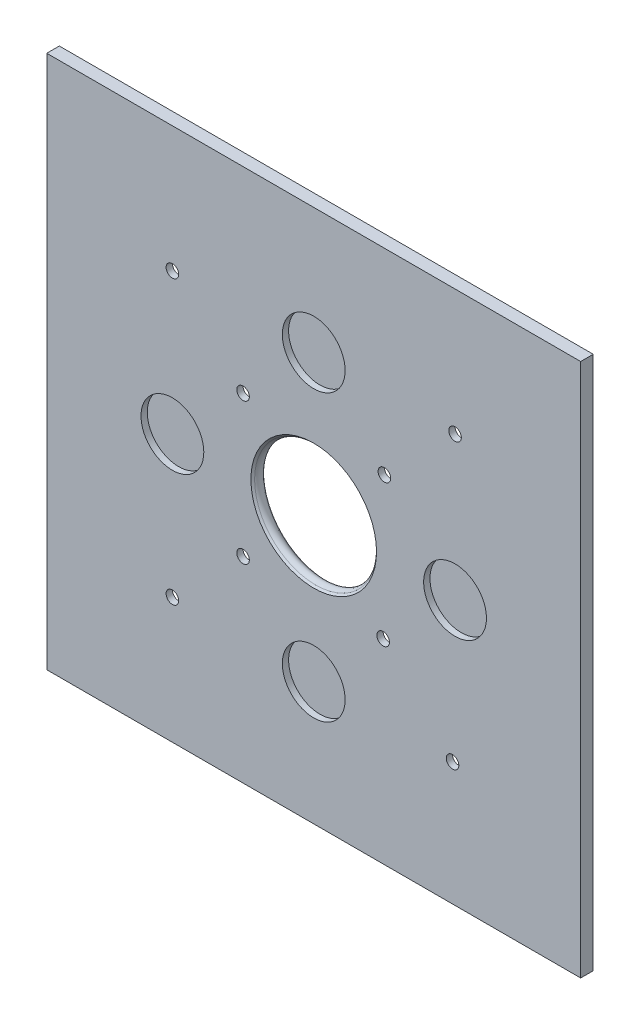
ISO-10303-21;
HEADER;
FILE_DESCRIPTION(('STEP AP214'),'2;1');
FILE_NAME('part.step','',(''),(''),'','','');
FILE_SCHEMA(('AUTOMOTIVE_DESIGN { 1 0 10303 214 1 1 1 1 }'));
ENDSEC;
DATA;
#1=APPLICATION_CONTEXT('core data for automotive mechanical design processes');
#2=APPLICATION_PROTOCOL_DEFINITION('international standard','automotive_design',2000,#1);
#3=PRODUCT_CONTEXT('',#1,'mechanical');
#4=PRODUCT('Part','Part','',(#3));
#5=PRODUCT_RELATED_PRODUCT_CATEGORY('part','',(#4));
#6=PRODUCT_DEFINITION_FORMATION('','',#4);
#7=PRODUCT_DEFINITION_CONTEXT('part definition',#1,'design');
#8=PRODUCT_DEFINITION('design','',#6,#7);
#9=PRODUCT_DEFINITION_SHAPE('','',#8);
#10=(LENGTH_UNIT() NAMED_UNIT(*) SI_UNIT(.MILLI.,.METRE.));
#11=(NAMED_UNIT(*) PLANE_ANGLE_UNIT() SI_UNIT($,.RADIAN.));
#12=(NAMED_UNIT(*) SI_UNIT($,.STERADIAN.) SOLID_ANGLE_UNIT());
#13=UNCERTAINTY_MEASURE_WITH_UNIT(LENGTH_MEASURE(1.E-05),#10,'distance_accuracy_value','');
#14=(GEOMETRIC_REPRESENTATION_CONTEXT(3) GLOBAL_UNCERTAINTY_ASSIGNED_CONTEXT((#13)) GLOBAL_UNIT_ASSIGNED_CONTEXT((#10,
#11,#12)) REPRESENTATION_CONTEXT('',''));
#15=CARTESIAN_POINT('',(0.,0.,0.));
#16=DIRECTION('',(0.,0.,1.));
#17=DIRECTION('',(1.,0.,0.));
#18=AXIS2_PLACEMENT_3D('',#15,#16,#17);
#19=CARTESIAN_POINT('',(-15.3853971962617,22.3971028037383,2.));
#20=DIRECTION('',(1.,0.,0.));
#21=DIRECTION('',(0.,1.,0.));
#22=AXIS2_PLACEMENT_3D('',#19,#20,#21);
#23=PLANE('',#22);
#24=DIRECTION('',(0.,-1.,0.));
#25=VECTOR('',#24,1.);
#26=CARTESIAN_POINT('',(-15.3853971962617,22.3971028037383,0.));
#27=LINE('',#26,#25);
#28=CARTESIAN_POINT('',(-15.3853971962617,22.3971028037383,0.));
#29=VERTEX_POINT('',#28);
#30=CARTESIAN_POINT('',(-15.3853971962617,-62.6028971962617,0.));
#31=VERTEX_POINT('',#30);
#32=EDGE_CURVE('E101',#29,#31,#27,.T.);
#33=ORIENTED_EDGE('',*,*,#32,.T.);
#34=DIRECTION('',(0.,0.,-1.));
#35=VECTOR('',#34,1.);
#36=CARTESIAN_POINT('',(-15.3853971962617,-62.6028971962617,2.));
#37=LINE('',#36,#35);
#38=CARTESIAN_POINT('',(-15.3853971962617,-62.6028971962617,2.));
#39=VERTEX_POINT('',#38);
#40=EDGE_CURVE('E93',#39,#31,#37,.T.);
#41=ORIENTED_EDGE('',*,*,#40,.F.);
#42=DIRECTION('',(0.,-1.,0.));
#43=VECTOR('',#42,1.);
#44=CARTESIAN_POINT('',(-15.3853971962617,22.3971028037383,2.));
#45=LINE('',#44,#43);
#46=CARTESIAN_POINT('',(-15.3853971962617,22.3971028037383,2.));
#47=VERTEX_POINT('',#46);
#48=EDGE_CURVE('E84',#47,#39,#45,.T.);
#49=ORIENTED_EDGE('',*,*,#48,.F.);
#50=DIRECTION('',(0.,0.,-1.));
#51=VECTOR('',#50,1.);
#52=CARTESIAN_POINT('',(-15.3853971962617,22.3971028037383,2.));
#53=LINE('',#52,#51);
#54=EDGE_CURVE('E50',#47,#29,#53,.T.);
#55=ORIENTED_EDGE('',*,*,#54,.T.);
#56=EDGE_LOOP('',(#33,#41,#49,#55));
#57=FACE_BOUND('',#56,.T.);
#58=ADVANCED_FACE('F33',(#57),#23,.F.);
#59=CARTESIAN_POINT('',(-15.3853971962617,-62.6028971962617,2.));
#60=DIRECTION('',(0.,1.,0.));
#61=DIRECTION('',(0.,0.,1.));
#62=AXIS2_PLACEMENT_3D('',#59,#60,#61);
#63=PLANE('',#62);
#64=DIRECTION('',(1.,0.,0.));
#65=VECTOR('',#64,1.);
#66=CARTESIAN_POINT('',(-15.3853971962617,-62.6028971962617,0.));
#67=LINE('',#66,#65);
#68=CARTESIAN_POINT('',(69.6146028037383,-62.6028971962617,0.));
#69=VERTEX_POINT('',#68);
#70=EDGE_CURVE('E90',#31,#69,#67,.T.);
#71=ORIENTED_EDGE('',*,*,#70,.T.);
#72=DIRECTION('',(0.,0.,-1.));
#73=VECTOR('',#72,1.);
#74=CARTESIAN_POINT('',(69.6146028037383,-62.6028971962617,2.));
#75=LINE('',#74,#73);
#76=CARTESIAN_POINT('',(69.6146028037383,-62.6028971962617,2.));
#77=VERTEX_POINT('',#76);
#78=EDGE_CURVE('E88',#77,#69,#75,.T.);
#79=ORIENTED_EDGE('',*,*,#78,.F.);
#80=DIRECTION('',(1.,0.,0.));
#81=VECTOR('',#80,1.);
#82=CARTESIAN_POINT('',(-15.3853971962617,-62.6028971962617,2.));
#83=LINE('',#82,#81);
#84=EDGE_CURVE('E76',#39,#77,#83,.T.);
#85=ORIENTED_EDGE('',*,*,#84,.F.);
#86=ORIENTED_EDGE('',*,*,#40,.T.);
#87=EDGE_LOOP('',(#71,#79,#85,#86));
#88=FACE_BOUND('',#87,.T.);
#89=ADVANCED_FACE('F89',(#88),#63,.F.);
#90=CARTESIAN_POINT('',(69.6146028037383,22.3971028037383,2.));
#91=DIRECTION('',(1.,0.,0.));
#92=DIRECTION('',(0.,1.,0.));
#93=AXIS2_PLACEMENT_3D('',#90,#91,#92);
#94=PLANE('',#93);
#95=DIRECTION('',(0.,-1.,0.));
#96=VECTOR('',#95,1.);
#97=CARTESIAN_POINT('',(69.6146028037383,22.3971028037383,0.));
#98=LINE('',#97,#96);
#99=CARTESIAN_POINT('',(69.6146028037383,22.3971028037383,0.));
#100=VERTEX_POINT('',#99);
#101=EDGE_CURVE('E105',#100,#69,#98,.T.);
#102=ORIENTED_EDGE('',*,*,#101,.F.);
#103=DIRECTION('',(0.,0.,-1.));
#104=VECTOR('',#103,1.);
#105=CARTESIAN_POINT('',(69.6146028037383,22.3971028037383,2.));
#106=LINE('',#105,#104);
#107=CARTESIAN_POINT('',(69.6146028037383,22.3971028037383,2.));
#108=VERTEX_POINT('',#107);
#109=EDGE_CURVE('E64',#108,#100,#106,.T.);
#110=ORIENTED_EDGE('',*,*,#109,.F.);
#111=DIRECTION('',(0.,-1.,0.));
#112=VECTOR('',#111,1.);
#113=CARTESIAN_POINT('',(69.6146028037383,22.3971028037383,2.));
#114=LINE('',#113,#112);
#115=EDGE_CURVE('E83',#108,#77,#114,.T.);
#116=ORIENTED_EDGE('',*,*,#115,.T.);
#117=ORIENTED_EDGE('',*,*,#78,.T.);
#118=EDGE_LOOP('',(#102,#110,#116,#117));
#119=FACE_BOUND('',#118,.T.);
#120=ADVANCED_FACE('F95',(#119),#94,.T.);
#121=CARTESIAN_POINT('',(-15.3853971962617,22.3971028037383,2.));
#122=DIRECTION('',(0.,1.,0.));
#123=DIRECTION('',(0.,0.,1.));
#124=AXIS2_PLACEMENT_3D('',#121,#122,#123);
#125=PLANE('',#124);
#126=DIRECTION('',(1.,0.,0.));
#127=VECTOR('',#126,1.);
#128=CARTESIAN_POINT('',(-15.3853971962617,22.3971028037383,0.));
#129=LINE('',#128,#127);
#130=EDGE_CURVE('E107',#29,#100,#129,.T.);
#131=ORIENTED_EDGE('',*,*,#130,.F.);
#132=ORIENTED_EDGE('',*,*,#54,.F.);
#133=DIRECTION('',(1.,0.,0.));
#134=VECTOR('',#133,1.);
#135=CARTESIAN_POINT('',(-15.3853971962617,22.3971028037383,2.));
#136=LINE('',#135,#134);
#137=EDGE_CURVE('E96',#47,#108,#136,.T.);
#138=ORIENTED_EDGE('',*,*,#137,.T.);
#139=ORIENTED_EDGE('',*,*,#109,.T.);
#140=EDGE_LOOP('',(#131,#132,#138,#139));
#141=FACE_BOUND('',#140,.T.);
#142=ADVANCED_FACE('F213',(#141),#125,.T.);
#143=CARTESIAN_POINT('',(0.,0.,2.));
#144=DIRECTION('',(0.,0.,1.));
#145=DIRECTION('',(1.,0.,0.));
#146=AXIS2_PLACEMENT_3D('',#143,#144,#145);
#147=PLANE('',#146);
#148=CARTESIAN_POINT('',(27.1146028037383,-20.1028971962617,2.));
#149=DIRECTION('',(0.,0.,1.));
#150=DIRECTION('',(1.,0.,0.));
#151=AXIS2_PLACEMENT_3D('',#148,#149,#150);
#152=CIRCLE('',#151,10.);
#153=CARTESIAN_POINT('',(37.1146028037384,-20.1028971962617,2.));
#154=VERTEX_POINT('',#153);
#155=EDGE_CURVE('E142',#154,#154,#152,.F.);
#156=ORIENTED_EDGE('',*,*,#155,.T.);
#157=EDGE_LOOP('',(#156));
#158=FACE_BOUND('',#157,.T.);
#159=CARTESIAN_POINT('',(38.3646028037383,-8.8528971962617,2.));
#160=DIRECTION('',(0.,0.,-1.));
#161=DIRECTION('',(-1.,0.,0.));
#162=AXIS2_PLACEMENT_3D('',#159,#160,#161);
#163=CIRCLE('',#162,0.999999999999998);
#164=CARTESIAN_POINT('',(37.3646028037383,-8.8528971962617,2.));
#165=VERTEX_POINT('',#164);
#166=EDGE_CURVE('E353',#165,#165,#163,.T.);
#167=ORIENTED_EDGE('',*,*,#166,.T.);
#168=EDGE_LOOP('',(#167));
#169=FACE_BOUND('',#168,.T.);
#170=CARTESIAN_POINT('',(4.61460280373833,2.39710280373829,2.));
#171=DIRECTION('',(0.,0.,-1.));
#172=DIRECTION('',(-1.,0.,0.));
#173=AXIS2_PLACEMENT_3D('',#170,#171,#172);
#174=CIRCLE('',#173,1.);
#175=CARTESIAN_POINT('',(3.61460280373833,2.39710280373829,2.));
#176=VERTEX_POINT('',#175);
#177=EDGE_CURVE('E357',#176,#176,#174,.T.);
#178=ORIENTED_EDGE('',*,*,#177,.T.);
#179=EDGE_LOOP('',(#178));
#180=FACE_BOUND('',#179,.T.);
#181=CARTESIAN_POINT('',(15.8646028037383,-8.8528971962617,2.));
#182=DIRECTION('',(0.,0.,-1.));
#183=DIRECTION('',(-1.,0.,0.));
#184=AXIS2_PLACEMENT_3D('',#181,#182,#183);
#185=CIRCLE('',#184,1.);
#186=CARTESIAN_POINT('',(14.8646028037383,-8.8528971962617,2.));
#187=VERTEX_POINT('',#186);
#188=EDGE_CURVE('E366',#187,#187,#185,.T.);
#189=ORIENTED_EDGE('',*,*,#188,.T.);
#190=EDGE_LOOP('',(#189));
#191=FACE_BOUND('',#190,.T.);
#192=CARTESIAN_POINT('',(15.8646028037383,-31.3528971962617,2.));
#193=DIRECTION('',(0.,0.,-1.));
#194=DIRECTION('',(-1.,0.,0.));
#195=AXIS2_PLACEMENT_3D('',#192,#193,#194);
#196=CIRCLE('',#195,1.);
#197=CARTESIAN_POINT('',(14.8646028037383,-31.3528971962617,2.));
#198=VERTEX_POINT('',#197);
#199=EDGE_CURVE('E368',#198,#198,#196,.T.);
#200=ORIENTED_EDGE('',*,*,#199,.T.);
#201=EDGE_LOOP('',(#200));
#202=FACE_BOUND('',#201,.T.);
#203=CARTESIAN_POINT('',(49.6146028037383,2.39710280373829,2.));
#204=DIRECTION('',(0.,0.,-1.));
#205=DIRECTION('',(-1.,0.,0.));
#206=AXIS2_PLACEMENT_3D('',#203,#204,#205);
#207=CIRCLE('',#206,0.999999999999998);
#208=CARTESIAN_POINT('',(48.6146028037383,2.39710280373829,2.));
#209=VERTEX_POINT('',#208);
#210=EDGE_CURVE('E351',#209,#209,#207,.T.);
#211=ORIENTED_EDGE('',*,*,#210,.T.);
#212=EDGE_LOOP('',(#211));
#213=FACE_BOUND('',#212,.T.);
#214=CARTESIAN_POINT('',(49.2154935543501,-42.9950493019402,2.));
#215=DIRECTION('',(0.,0.,-1.));
#216=DIRECTION('',(-1.,0.,0.));
#217=AXIS2_PLACEMENT_3D('',#214,#215,#216);
#218=CIRCLE('',#217,0.999999999999998);
#219=CARTESIAN_POINT('',(48.2154935543501,-42.9950493019402,2.));
#220=VERTEX_POINT('',#219);
#221=EDGE_CURVE('E354',#220,#220,#218,.T.);
#222=ORIENTED_EDGE('',*,*,#221,.T.);
#223=EDGE_LOOP('',(#222));
#224=FACE_BOUND('',#223,.T.);
#225=CARTESIAN_POINT('',(38.1650481790442,-31.5489732491009,2.));
#226=DIRECTION('',(0.,0.,-1.));
#227=DIRECTION('',(-1.,0.,0.));
#228=AXIS2_PLACEMENT_3D('',#225,#226,#227);
#229=CIRCLE('',#228,0.999999999999998);
#230=CARTESIAN_POINT('',(37.1650481790442,-31.5489732491009,2.));
#231=VERTEX_POINT('',#230);
#232=EDGE_CURVE('E360',#231,#231,#229,.T.);
#233=ORIENTED_EDGE('',*,*,#232,.T.);
#234=EDGE_LOOP('',(#233));
#235=FACE_BOUND('',#234,.T.);
#236=CARTESIAN_POINT('',(4.61460280373834,-42.6028971962617,2.));
#237=DIRECTION('',(0.,0.,-1.));
#238=DIRECTION('',(-1.,0.,0.));
#239=AXIS2_PLACEMENT_3D('',#236,#237,#238);
#240=CIRCLE('',#239,1.);
#241=CARTESIAN_POINT('',(3.61460280373833,-42.6028971962617,2.));
#242=VERTEX_POINT('',#241);
#243=EDGE_CURVE('E118',#242,#242,#240,.T.);
#244=ORIENTED_EDGE('',*,*,#243,.T.);
#245=EDGE_LOOP('',(#244));
#246=FACE_BOUND('',#245,.T.);
#247=CARTESIAN_POINT('',(49.6146028037383,-20.4950493019402,2.));
#248=DIRECTION('',(0.,0.,1.));
#249=DIRECTION('',(1.,0.,0.));
#250=AXIS2_PLACEMENT_3D('',#247,#248,#249);
#251=CIRCLE('',#250,5.);
#252=CARTESIAN_POINT('',(54.6146028037383,-20.4950493019402,2.));
#253=VERTEX_POINT('',#252);
#254=EDGE_CURVE('E410',#253,#253,#251,.T.);
#255=ORIENTED_EDGE('',*,*,#254,.F.);
#256=EDGE_LOOP('',(#255));
#257=FACE_BOUND('',#256,.T.);
#258=CARTESIAN_POINT('',(27.1146028037383,2.39710280373829,2.));
#259=DIRECTION('',(0.,0.,1.));
#260=DIRECTION('',(1.,0.,0.));
#261=AXIS2_PLACEMENT_3D('',#258,#259,#260);
#262=CIRCLE('',#261,5.);
#263=CARTESIAN_POINT('',(32.1146028037383,2.39710280373829,2.));
#264=VERTEX_POINT('',#263);
#265=EDGE_CURVE('E416',#264,#264,#262,.T.);
#266=ORIENTED_EDGE('',*,*,#265,.F.);
#267=EDGE_LOOP('',(#266));
#268=FACE_BOUND('',#267,.T.);
#269=CARTESIAN_POINT('',(27.1146028037383,-42.9950493019402,2.));
#270=DIRECTION('',(0.,0.,1.));
#271=DIRECTION('',(1.,0.,0.));
#272=AXIS2_PLACEMENT_3D('',#269,#270,#271);
#273=CIRCLE('',#272,5.);
#274=CARTESIAN_POINT('',(32.1146028037383,-42.9950493019402,2.));
#275=VERTEX_POINT('',#274);
#276=EDGE_CURVE('E422',#275,#275,#273,.T.);
#277=ORIENTED_EDGE('',*,*,#276,.F.);
#278=EDGE_LOOP('',(#277));
#279=FACE_BOUND('',#278,.T.);
#280=CARTESIAN_POINT('',(4.61460280373833,-20.1028971962617,2.));
#281=DIRECTION('',(0.,0.,1.));
#282=DIRECTION('',(1.,0.,0.));
#283=AXIS2_PLACEMENT_3D('',#280,#281,#282);
#284=CIRCLE('',#283,5.);
#285=CARTESIAN_POINT('',(9.61460280373833,-20.1028971962617,2.));
#286=VERTEX_POINT('',#285);
#287=EDGE_CURVE('E406',#286,#286,#284,.T.);
#288=ORIENTED_EDGE('',*,*,#287,.F.);
#289=EDGE_LOOP('',(#288));
#290=FACE_BOUND('',#289,.T.);
#291=ORIENTED_EDGE('',*,*,#48,.T.);
#292=ORIENTED_EDGE('',*,*,#84,.T.);
#293=ORIENTED_EDGE('',*,*,#115,.F.);
#294=ORIENTED_EDGE('',*,*,#137,.F.);
#295=EDGE_LOOP('',(#291,#292,#293,#294));
#296=FACE_BOUND('',#295,.T.);
#297=ADVANCED_FACE('F80',(#158,#169,#180,#191,#202,#213,#224,#235,#246,#257,#268,#279,#290,
#296),#147,.T.);
#298=CARTESIAN_POINT('',(0.,0.,0.));
#299=DIRECTION('',(0.,0.,1.));
#300=DIRECTION('',(1.,0.,0.));
#301=AXIS2_PLACEMENT_3D('',#298,#299,#300);
#302=PLANE('',#301);
#303=CARTESIAN_POINT('',(27.1146028037383,-20.1028971962617,0.));
#304=DIRECTION('',(0.,0.,1.));
#305=DIRECTION('',(1.,0.,0.));
#306=AXIS2_PLACEMENT_3D('',#303,#304,#305);
#307=CIRCLE('',#306,10.);
#308=CARTESIAN_POINT('',(37.1146028037383,-20.1028971962617,0.));
#309=VERTEX_POINT('',#308);
#310=EDGE_CURVE('E113',#309,#309,#307,.T.);
#311=ORIENTED_EDGE('',*,*,#310,.T.);
#312=EDGE_LOOP('',(#311));
#313=FACE_BOUND('',#312,.T.);
#314=CARTESIAN_POINT('',(4.61460280373834,-42.6028971962617,0.));
#315=DIRECTION('',(0.,0.,-1.));
#316=DIRECTION('',(-1.,0.,0.));
#317=AXIS2_PLACEMENT_3D('',#314,#315,#316);
#318=CIRCLE('',#317,5.);
#319=CARTESIAN_POINT('',(-0.385397196261665,-42.6028971962617,0.));
#320=VERTEX_POINT('',#319);
#321=EDGE_CURVE('E185',#320,#320,#318,.T.);
#322=ORIENTED_EDGE('',*,*,#321,.F.);
#323=EDGE_LOOP('',(#322));
#324=FACE_BOUND('',#323,.T.);
#325=CARTESIAN_POINT('',(38.3646028037383,-8.8528971962617,0.));
#326=DIRECTION('',(0.,0.,-1.));
#327=DIRECTION('',(-1.,0.,0.));
#328=AXIS2_PLACEMENT_3D('',#325,#326,#327);
#329=CIRCLE('',#328,5.);
#330=CARTESIAN_POINT('',(33.3646028037383,-8.8528971962617,0.));
#331=VERTEX_POINT('',#330);
#332=EDGE_CURVE('E189',#331,#331,#329,.T.);
#333=ORIENTED_EDGE('',*,*,#332,.F.);
#334=EDGE_LOOP('',(#333));
#335=FACE_BOUND('',#334,.T.);
#336=CARTESIAN_POINT('',(49.6146028037383,2.39710280373829,0.));
#337=DIRECTION('',(0.,0.,-1.));
#338=DIRECTION('',(-1.,0.,0.));
#339=AXIS2_PLACEMENT_3D('',#336,#337,#338);
#340=CIRCLE('',#339,5.);
#341=CARTESIAN_POINT('',(44.6146028037383,2.39710280373829,0.));
#342=VERTEX_POINT('',#341);
#343=EDGE_CURVE('E193',#342,#342,#340,.T.);
#344=ORIENTED_EDGE('',*,*,#343,.F.);
#345=EDGE_LOOP('',(#344));
#346=FACE_BOUND('',#345,.T.);
#347=CARTESIAN_POINT('',(38.1650481790442,-31.5489732491009,0.));
#348=DIRECTION('',(0.,0.,-1.));
#349=DIRECTION('',(-1.,0.,0.));
#350=AXIS2_PLACEMENT_3D('',#347,#348,#349);
#351=CIRCLE('',#350,5.);
#352=CARTESIAN_POINT('',(33.1650481790442,-31.5489732491009,0.));
#353=VERTEX_POINT('',#352);
#354=EDGE_CURVE('E197',#353,#353,#351,.T.);
#355=ORIENTED_EDGE('',*,*,#354,.F.);
#356=EDGE_LOOP('',(#355));
#357=FACE_BOUND('',#356,.T.);
#358=CARTESIAN_POINT('',(15.8646028037383,-8.8528971962617,0.));
#359=DIRECTION('',(0.,0.,-1.));
#360=DIRECTION('',(-1.,0.,0.));
#361=AXIS2_PLACEMENT_3D('',#358,#359,#360);
#362=CIRCLE('',#361,5.);
#363=CARTESIAN_POINT('',(10.8646028037383,-8.8528971962617,0.));
#364=VERTEX_POINT('',#363);
#365=EDGE_CURVE('E139',#364,#364,#362,.T.);
#366=ORIENTED_EDGE('',*,*,#365,.F.);
#367=EDGE_LOOP('',(#366));
#368=FACE_BOUND('',#367,.T.);
#369=CARTESIAN_POINT('',(4.61460280373833,2.39710280373829,0.));
#370=DIRECTION('',(0.,0.,-1.));
#371=DIRECTION('',(-1.,0.,0.));
#372=AXIS2_PLACEMENT_3D('',#369,#370,#371);
#373=CIRCLE('',#372,5.);
#374=CARTESIAN_POINT('',(-0.385397196261668,2.39710280373829,0.));
#375=VERTEX_POINT('',#374);
#376=EDGE_CURVE('E204',#375,#375,#373,.T.);
#377=ORIENTED_EDGE('',*,*,#376,.F.);
#378=EDGE_LOOP('',(#377));
#379=FACE_BOUND('',#378,.T.);
#380=CARTESIAN_POINT('',(15.8646028037383,-31.3528971962617,0.));
#381=DIRECTION('',(0.,0.,-1.));
#382=DIRECTION('',(-1.,0.,0.));
#383=AXIS2_PLACEMENT_3D('',#380,#381,#382);
#384=CIRCLE('',#383,5.);
#385=CARTESIAN_POINT('',(10.8646028037383,-31.3528971962617,0.));
#386=VERTEX_POINT('',#385);
#387=EDGE_CURVE('E208',#386,#386,#384,.T.);
#388=ORIENTED_EDGE('',*,*,#387,.F.);
#389=EDGE_LOOP('',(#388));
#390=FACE_BOUND('',#389,.T.);
#391=CARTESIAN_POINT('',(49.2154935543501,-42.9950493019402,0.));
#392=DIRECTION('',(0.,0.,-1.));
#393=DIRECTION('',(-1.,0.,0.));
#394=AXIS2_PLACEMENT_3D('',#391,#392,#393);
#395=CIRCLE('',#394,5.);
#396=CARTESIAN_POINT('',(44.2154935543502,-42.9950493019402,0.));
#397=VERTEX_POINT('',#396);
#398=EDGE_CURVE('E212',#397,#397,#395,.T.);
#399=ORIENTED_EDGE('',*,*,#398,.F.);
#400=EDGE_LOOP('',(#399));
#401=FACE_BOUND('',#400,.T.);
#402=ORIENTED_EDGE('',*,*,#32,.F.);
#403=ORIENTED_EDGE('',*,*,#130,.T.);
#404=ORIENTED_EDGE('',*,*,#101,.T.);
#405=ORIENTED_EDGE('',*,*,#70,.F.);
#406=EDGE_LOOP('',(#402,#403,#404,#405));
#407=FACE_BOUND('',#406,.T.);
#408=ADVANCED_FACE('F177',(#313,#324,#335,#346,#357,#368,#379,#390,#401,#407),#302,.F.);
#409=CARTESIAN_POINT('',(4.61460280373833,-20.1028971962617,1.));
#410=DIRECTION('',(0.,0.,1.));
#411=DIRECTION('',(1.,0.,0.));
#412=AXIS2_PLACEMENT_3D('',#409,#410,#411);
#413=CYLINDRICAL_SURFACE('',#412,5.);
#414=CARTESIAN_POINT('',(4.61460280373833,-20.1028971962617,1.));
#415=DIRECTION('',(0.,0.,1.));
#416=DIRECTION('',(1.,0.,0.));
#417=AXIS2_PLACEMENT_3D('',#414,#415,#416);
#418=CIRCLE('',#417,5.);
#419=CARTESIAN_POINT('',(9.61460280373833,-20.1028971962617,1.));
#420=VERTEX_POINT('',#419);
#421=EDGE_CURVE('E425',#420,#420,#418,.T.);
#422=ORIENTED_EDGE('',*,*,#421,.F.);
#423=EDGE_LOOP('',(#422));
#424=FACE_BOUND('',#423,.T.);
#425=ORIENTED_EDGE('',*,*,#287,.T.);
#426=EDGE_LOOP('',(#425));
#427=FACE_BOUND('',#426,.T.);
#428=ADVANCED_FACE('F180',(#424,#427),#413,.F.);
#429=CARTESIAN_POINT('',(4.61460280373833,-20.1028971962617,1.));
#430=DIRECTION('',(0.,0.,1.));
#431=DIRECTION('',(1.,0.,0.));
#432=AXIS2_PLACEMENT_3D('',#429,#430,#431);
#433=PLANE('',#432);
#434=ORIENTED_EDGE('',*,*,#421,.T.);
#435=EDGE_LOOP('',(#434));
#436=FACE_BOUND('',#435,.T.);
#437=ADVANCED_FACE('F226',(#436),#433,.T.);
#438=CARTESIAN_POINT('',(27.1146028037383,-42.9950493019402,1.));
#439=DIRECTION('',(0.,0.,1.));
#440=DIRECTION('',(1.,0.,0.));
#441=AXIS2_PLACEMENT_3D('',#438,#439,#440);
#442=CYLINDRICAL_SURFACE('',#441,5.);
#443=CARTESIAN_POINT('',(27.1146028037383,-42.9950493019402,1.));
#444=DIRECTION('',(0.,0.,1.));
#445=DIRECTION('',(1.,0.,0.));
#446=AXIS2_PLACEMENT_3D('',#443,#444,#445);
#447=CIRCLE('',#446,5.);
#448=CARTESIAN_POINT('',(32.1146028037383,-42.9950493019402,1.));
#449=VERTEX_POINT('',#448);
#450=EDGE_CURVE('E419',#449,#449,#447,.T.);
#451=ORIENTED_EDGE('',*,*,#450,.F.);
#452=EDGE_LOOP('',(#451));
#453=FACE_BOUND('',#452,.T.);
#454=ORIENTED_EDGE('',*,*,#276,.T.);
#455=EDGE_LOOP('',(#454));
#456=FACE_BOUND('',#455,.T.);
#457=ADVANCED_FACE('F230',(#453,#456),#442,.F.);
#458=CARTESIAN_POINT('',(27.1146028037383,-42.9950493019402,1.));
#459=DIRECTION('',(0.,0.,1.));
#460=DIRECTION('',(1.,0.,0.));
#461=AXIS2_PLACEMENT_3D('',#458,#459,#460);
#462=PLANE('',#461);
#463=ORIENTED_EDGE('',*,*,#450,.T.);
#464=EDGE_LOOP('',(#463));
#465=FACE_BOUND('',#464,.T.);
#466=ADVANCED_FACE('F234',(#465),#462,.T.);
#467=CARTESIAN_POINT('',(27.1146028037383,2.39710280373829,1.));
#468=DIRECTION('',(0.,0.,1.));
#469=DIRECTION('',(1.,0.,0.));
#470=AXIS2_PLACEMENT_3D('',#467,#468,#469);
#471=CYLINDRICAL_SURFACE('',#470,5.);
#472=CARTESIAN_POINT('',(27.1146028037383,2.39710280373829,1.));
#473=DIRECTION('',(0.,0.,1.));
#474=DIRECTION('',(1.,0.,0.));
#475=AXIS2_PLACEMENT_3D('',#472,#473,#474);
#476=CIRCLE('',#475,5.);
#477=CARTESIAN_POINT('',(32.1146028037383,2.39710280373829,1.));
#478=VERTEX_POINT('',#477);
#479=EDGE_CURVE('E413',#478,#478,#476,.T.);
#480=ORIENTED_EDGE('',*,*,#479,.F.);
#481=EDGE_LOOP('',(#480));
#482=FACE_BOUND('',#481,.T.);
#483=ORIENTED_EDGE('',*,*,#265,.T.);
#484=EDGE_LOOP('',(#483));
#485=FACE_BOUND('',#484,.T.);
#486=ADVANCED_FACE('F238',(#482,#485),#471,.F.);
#487=CARTESIAN_POINT('',(27.1146028037383,2.39710280373829,1.));
#488=DIRECTION('',(0.,0.,1.));
#489=DIRECTION('',(1.,0.,0.));
#490=AXIS2_PLACEMENT_3D('',#487,#488,#489);
#491=PLANE('',#490);
#492=ORIENTED_EDGE('',*,*,#479,.T.);
#493=EDGE_LOOP('',(#492));
#494=FACE_BOUND('',#493,.T.);
#495=ADVANCED_FACE('F242',(#494),#491,.T.);
#496=CARTESIAN_POINT('',(49.6146028037383,-20.4950493019402,1.));
#497=DIRECTION('',(0.,0.,1.));
#498=DIRECTION('',(1.,0.,0.));
#499=AXIS2_PLACEMENT_3D('',#496,#497,#498);
#500=CYLINDRICAL_SURFACE('',#499,5.);
#501=CARTESIAN_POINT('',(49.6146028037383,-20.4950493019402,1.));
#502=DIRECTION('',(0.,0.,1.));
#503=DIRECTION('',(1.,0.,0.));
#504=AXIS2_PLACEMENT_3D('',#501,#502,#503);
#505=CIRCLE('',#504,5.);
#506=CARTESIAN_POINT('',(54.6146028037383,-20.4950493019402,1.));
#507=VERTEX_POINT('',#506);
#508=EDGE_CURVE('E103',#507,#507,#505,.T.);
#509=ORIENTED_EDGE('',*,*,#508,.F.);
#510=EDGE_LOOP('',(#509));
#511=FACE_BOUND('',#510,.T.);
#512=ORIENTED_EDGE('',*,*,#254,.T.);
#513=EDGE_LOOP('',(#512));
#514=FACE_BOUND('',#513,.T.);
#515=ADVANCED_FACE('F246',(#511,#514),#500,.F.);
#516=CARTESIAN_POINT('',(49.6146028037383,-20.4950493019402,1.));
#517=DIRECTION('',(0.,0.,1.));
#518=DIRECTION('',(1.,0.,0.));
#519=AXIS2_PLACEMENT_3D('',#516,#517,#518);
#520=PLANE('',#519);
#521=ORIENTED_EDGE('',*,*,#508,.T.);
#522=EDGE_LOOP('',(#521));
#523=FACE_BOUND('',#522,.T.);
#524=ADVANCED_FACE('F250',(#523),#520,.T.);
#525=CARTESIAN_POINT('',(49.2154935543501,-42.9950493019402,1.));
#526=DIRECTION('',(0.,0.,-1.));
#527=DIRECTION('',(-1.,0.,0.));
#528=AXIS2_PLACEMENT_3D('',#525,#526,#527);
#529=CYLINDRICAL_SURFACE('',#528,5.);
#530=CARTESIAN_POINT('',(49.2154935543501,-42.9950493019402,1.));
#531=DIRECTION('',(0.,0.,-1.));
#532=DIRECTION('',(-1.,0.,0.));
#533=AXIS2_PLACEMENT_3D('',#530,#531,#532);
#534=CIRCLE('',#533,5.);
#535=CARTESIAN_POINT('',(44.2154935543502,-42.9950493019402,1.));
#536=VERTEX_POINT('',#535);
#537=EDGE_CURVE('E403',#536,#536,#534,.T.);
#538=ORIENTED_EDGE('',*,*,#537,.F.);
#539=EDGE_LOOP('',(#538));
#540=FACE_BOUND('',#539,.T.);
#541=ORIENTED_EDGE('',*,*,#398,.T.);
#542=EDGE_LOOP('',(#541));
#543=FACE_BOUND('',#542,.T.);
#544=ADVANCED_FACE('F254',(#540,#543),#529,.F.);
#545=CARTESIAN_POINT('',(49.2154935543501,-42.9950493019402,1.));
#546=DIRECTION('',(0.,0.,-1.));
#547=DIRECTION('',(-1.,0.,0.));
#548=AXIS2_PLACEMENT_3D('',#545,#546,#547);
#549=PLANE('',#548);
#550=CARTESIAN_POINT('',(49.2154935543501,-42.9950493019402,1.));
#551=DIRECTION('',(0.,0.,-1.));
#552=DIRECTION('',(-1.,0.,0.));
#553=AXIS2_PLACEMENT_3D('',#550,#551,#552);
#554=CIRCLE('',#553,0.999999999999998);
#555=CARTESIAN_POINT('',(48.2154935543501,-42.9950493019402,1.));
#556=VERTEX_POINT('',#555);
#557=EDGE_CURVE('E136',#556,#556,#554,.T.);
#558=ORIENTED_EDGE('',*,*,#557,.F.);
#559=EDGE_LOOP('',(#558));
#560=FACE_BOUND('',#559,.T.);
#561=ORIENTED_EDGE('',*,*,#537,.T.);
#562=EDGE_LOOP('',(#561));
#563=FACE_BOUND('',#562,.T.);
#564=ADVANCED_FACE('F258',(#560,#563),#549,.T.);
#565=CARTESIAN_POINT('',(15.8646028037383,-31.3528971962617,1.));
#566=DIRECTION('',(0.,0.,-1.));
#567=DIRECTION('',(-1.,0.,0.));
#568=AXIS2_PLACEMENT_3D('',#565,#566,#567);
#569=CYLINDRICAL_SURFACE('',#568,5.);
#570=CARTESIAN_POINT('',(15.8646028037383,-31.3528971962617,1.));
#571=DIRECTION('',(0.,0.,-1.));
#572=DIRECTION('',(-1.,0.,0.));
#573=AXIS2_PLACEMENT_3D('',#570,#571,#572);
#574=CIRCLE('',#573,5.);
#575=CARTESIAN_POINT('',(10.8646028037383,-31.3528971962617,1.));
#576=VERTEX_POINT('',#575);
#577=EDGE_CURVE('E379',#576,#576,#574,.T.);
#578=ORIENTED_EDGE('',*,*,#577,.F.);
#579=EDGE_LOOP('',(#578));
#580=FACE_BOUND('',#579,.T.);
#581=ORIENTED_EDGE('',*,*,#387,.T.);
#582=EDGE_LOOP('',(#581));
#583=FACE_BOUND('',#582,.T.);
#584=ADVANCED_FACE('F262',(#580,#583),#569,.F.);
#585=CARTESIAN_POINT('',(15.8646028037383,-31.3528971962617,1.));
#586=DIRECTION('',(0.,0.,-1.));
#587=DIRECTION('',(-1.,0.,0.));
#588=AXIS2_PLACEMENT_3D('',#585,#586,#587);
#589=PLANE('',#588);
#590=CARTESIAN_POINT('',(15.8646028037383,-31.3528971962617,1.));
#591=DIRECTION('',(0.,0.,-1.));
#592=DIRECTION('',(-1.,0.,0.));
#593=AXIS2_PLACEMENT_3D('',#590,#591,#592);
#594=CIRCLE('',#593,1.);
#595=CARTESIAN_POINT('',(14.8646028037383,-31.3528971962617,1.));
#596=VERTEX_POINT('',#595);
#597=EDGE_CURVE('E133',#596,#596,#594,.T.);
#598=ORIENTED_EDGE('',*,*,#597,.F.);
#599=EDGE_LOOP('',(#598));
#600=FACE_BOUND('',#599,.T.);
#601=ORIENTED_EDGE('',*,*,#577,.T.);
#602=EDGE_LOOP('',(#601));
#603=FACE_BOUND('',#602,.T.);
#604=ADVANCED_FACE('F302',(#600,#603),#589,.T.);
#605=CARTESIAN_POINT('',(4.61460280373833,2.39710280373829,1.));
#606=DIRECTION('',(0.,0.,-1.));
#607=DIRECTION('',(-1.,0.,0.));
#608=AXIS2_PLACEMENT_3D('',#605,#606,#607);
#609=CYLINDRICAL_SURFACE('',#608,5.);
#610=CARTESIAN_POINT('',(4.61460280373833,2.39710280373829,1.));
#611=DIRECTION('',(0.,0.,-1.));
#612=DIRECTION('',(-1.,0.,0.));
#613=AXIS2_PLACEMENT_3D('',#610,#611,#612);
#614=CIRCLE('',#613,5.);
#615=CARTESIAN_POINT('',(-0.385397196261668,2.39710280373829,1.));
#616=VERTEX_POINT('',#615);
#617=EDGE_CURVE('E383',#616,#616,#614,.T.);
#618=ORIENTED_EDGE('',*,*,#617,.F.);
#619=EDGE_LOOP('',(#618));
#620=FACE_BOUND('',#619,.T.);
#621=ORIENTED_EDGE('',*,*,#376,.T.);
#622=EDGE_LOOP('',(#621));
#623=FACE_BOUND('',#622,.T.);
#624=ADVANCED_FACE('F298',(#620,#623),#609,.F.);
#625=CARTESIAN_POINT('',(4.61460280373833,2.39710280373829,1.));
#626=DIRECTION('',(0.,0.,-1.));
#627=DIRECTION('',(-1.,0.,0.));
#628=AXIS2_PLACEMENT_3D('',#625,#626,#627);
#629=PLANE('',#628);
#630=CARTESIAN_POINT('',(4.61460280373833,2.39710280373829,1.));
#631=DIRECTION('',(0.,0.,-1.));
#632=DIRECTION('',(-1.,0.,0.));
#633=AXIS2_PLACEMENT_3D('',#630,#631,#632);
#634=CIRCLE('',#633,1.);
#635=CARTESIAN_POINT('',(3.61460280373833,2.39710280373829,1.));
#636=VERTEX_POINT('',#635);
#637=EDGE_CURVE('E130',#636,#636,#634,.T.);
#638=ORIENTED_EDGE('',*,*,#637,.F.);
#639=EDGE_LOOP('',(#638));
#640=FACE_BOUND('',#639,.T.);
#641=ORIENTED_EDGE('',*,*,#617,.T.);
#642=EDGE_LOOP('',(#641));
#643=FACE_BOUND('',#642,.T.);
#644=ADVANCED_FACE('F301',(#640,#643),#629,.T.);
#645=CARTESIAN_POINT('',(15.8646028037383,-8.8528971962617,1.));
#646=DIRECTION('',(0.,0.,-1.));
#647=DIRECTION('',(-1.,0.,0.));
#648=AXIS2_PLACEMENT_3D('',#645,#646,#647);
#649=CYLINDRICAL_SURFACE('',#648,5.);
#650=CARTESIAN_POINT('',(15.8646028037383,-8.8528971962617,1.));
#651=DIRECTION('',(0.,0.,-1.));
#652=DIRECTION('',(-1.,0.,0.));
#653=AXIS2_PLACEMENT_3D('',#650,#651,#652);
#654=CIRCLE('',#653,5.);
#655=CARTESIAN_POINT('',(10.8646028037383,-8.8528971962617,1.));
#656=VERTEX_POINT('',#655);
#657=EDGE_CURVE('E375',#656,#656,#654,.T.);
#658=ORIENTED_EDGE('',*,*,#657,.F.);
#659=EDGE_LOOP('',(#658));
#660=FACE_BOUND('',#659,.T.);
#661=ORIENTED_EDGE('',*,*,#365,.T.);
#662=EDGE_LOOP('',(#661));
#663=FACE_BOUND('',#662,.T.);
#664=ADVANCED_FACE('F306',(#660,#663),#649,.F.);
#665=CARTESIAN_POINT('',(15.8646028037383,-8.8528971962617,1.));
#666=DIRECTION('',(0.,0.,-1.));
#667=DIRECTION('',(-1.,0.,0.));
#668=AXIS2_PLACEMENT_3D('',#665,#666,#667);
#669=PLANE('',#668);
#670=CARTESIAN_POINT('',(15.8646028037383,-8.8528971962617,1.));
#671=DIRECTION('',(0.,0.,-1.));
#672=DIRECTION('',(-1.,0.,0.));
#673=AXIS2_PLACEMENT_3D('',#670,#671,#672);
#674=CIRCLE('',#673,1.);
#675=CARTESIAN_POINT('',(14.8646028037383,-8.8528971962617,1.));
#676=VERTEX_POINT('',#675);
#677=EDGE_CURVE('E127',#676,#676,#674,.T.);
#678=ORIENTED_EDGE('',*,*,#677,.F.);
#679=EDGE_LOOP('',(#678));
#680=FACE_BOUND('',#679,.T.);
#681=ORIENTED_EDGE('',*,*,#657,.T.);
#682=EDGE_LOOP('',(#681));
#683=FACE_BOUND('',#682,.T.);
#684=ADVANCED_FACE('F277',(#680,#683),#669,.T.);
#685=CARTESIAN_POINT('',(38.1650481790442,-31.5489732491009,1.));
#686=DIRECTION('',(0.,0.,-1.));
#687=DIRECTION('',(-1.,0.,0.));
#688=AXIS2_PLACEMENT_3D('',#685,#686,#687);
#689=CYLINDRICAL_SURFACE('',#688,5.);
#690=CARTESIAN_POINT('',(38.1650481790442,-31.5489732491009,1.));
#691=DIRECTION('',(0.,0.,-1.));
#692=DIRECTION('',(-1.,0.,0.));
#693=AXIS2_PLACEMENT_3D('',#690,#691,#692);
#694=CIRCLE('',#693,5.);
#695=CARTESIAN_POINT('',(33.1650481790442,-31.5489732491009,1.));
#696=VERTEX_POINT('',#695);
#697=EDGE_CURVE('E395',#696,#696,#694,.T.);
#698=ORIENTED_EDGE('',*,*,#697,.F.);
#699=EDGE_LOOP('',(#698));
#700=FACE_BOUND('',#699,.T.);
#701=ORIENTED_EDGE('',*,*,#354,.T.);
#702=EDGE_LOOP('',(#701));
#703=FACE_BOUND('',#702,.T.);
#704=ADVANCED_FACE('F274',(#700,#703),#689,.F.);
#705=CARTESIAN_POINT('',(38.1650481790442,-31.5489732491009,1.));
#706=DIRECTION('',(0.,0.,-1.));
#707=DIRECTION('',(-1.,0.,0.));
#708=AXIS2_PLACEMENT_3D('',#705,#706,#707);
#709=PLANE('',#708);
#710=CARTESIAN_POINT('',(38.1650481790442,-31.5489732491009,1.));
#711=DIRECTION('',(0.,0.,-1.));
#712=DIRECTION('',(-1.,0.,0.));
#713=AXIS2_PLACEMENT_3D('',#710,#711,#712);
#714=CIRCLE('',#713,0.999999999999998);
#715=CARTESIAN_POINT('',(37.1650481790442,-31.5489732491009,1.));
#716=VERTEX_POINT('',#715);
#717=EDGE_CURVE('E124',#716,#716,#714,.T.);
#718=ORIENTED_EDGE('',*,*,#717,.F.);
#719=EDGE_LOOP('',(#718));
#720=FACE_BOUND('',#719,.T.);
#721=ORIENTED_EDGE('',*,*,#697,.T.);
#722=EDGE_LOOP('',(#721));
#723=FACE_BOUND('',#722,.T.);
#724=ADVANCED_FACE('F268',(#720,#723),#709,.T.);
#725=CARTESIAN_POINT('',(49.6146028037383,2.39710280373829,1.));
#726=DIRECTION('',(0.,0.,-1.));
#727=DIRECTION('',(-1.,0.,0.));
#728=AXIS2_PLACEMENT_3D('',#725,#726,#727);
#729=CYLINDRICAL_SURFACE('',#728,5.);
#730=CARTESIAN_POINT('',(49.6146028037383,2.39710280373829,1.));
#731=DIRECTION('',(0.,0.,-1.));
#732=DIRECTION('',(-1.,0.,0.));
#733=AXIS2_PLACEMENT_3D('',#730,#731,#732);
#734=CIRCLE('',#733,5.);
#735=CARTESIAN_POINT('',(44.6146028037383,2.39710280373829,1.));
#736=VERTEX_POINT('',#735);
#737=EDGE_CURVE('E399',#736,#736,#734,.T.);
#738=ORIENTED_EDGE('',*,*,#737,.F.);
#739=EDGE_LOOP('',(#738));
#740=FACE_BOUND('',#739,.T.);
#741=ORIENTED_EDGE('',*,*,#343,.T.);
#742=EDGE_LOOP('',(#741));
#743=FACE_BOUND('',#742,.T.);
#744=ADVANCED_FACE('F264',(#740,#743),#729,.F.);
#745=CARTESIAN_POINT('',(49.6146028037383,2.39710280373829,1.));
#746=DIRECTION('',(0.,0.,-1.));
#747=DIRECTION('',(-1.,0.,0.));
#748=AXIS2_PLACEMENT_3D('',#745,#746,#747);
#749=PLANE('',#748);
#750=CARTESIAN_POINT('',(49.6146028037383,2.39710280373829,1.));
#751=DIRECTION('',(0.,0.,-1.));
#752=DIRECTION('',(-1.,0.,0.));
#753=AXIS2_PLACEMENT_3D('',#750,#751,#752);
#754=CIRCLE('',#753,0.999999999999998);
#755=CARTESIAN_POINT('',(48.6146028037383,2.39710280373829,1.));
#756=VERTEX_POINT('',#755);
#757=EDGE_CURVE('E121',#756,#756,#754,.T.);
#758=ORIENTED_EDGE('',*,*,#757,.F.);
#759=EDGE_LOOP('',(#758));
#760=FACE_BOUND('',#759,.T.);
#761=ORIENTED_EDGE('',*,*,#737,.T.);
#762=EDGE_LOOP('',(#761));
#763=FACE_BOUND('',#762,.T.);
#764=ADVANCED_FACE('F267',(#760,#763),#749,.T.);
#765=CARTESIAN_POINT('',(38.3646028037383,-8.8528971962617,1.));
#766=DIRECTION('',(0.,0.,-1.));
#767=DIRECTION('',(-1.,0.,0.));
#768=AXIS2_PLACEMENT_3D('',#765,#766,#767);
#769=CYLINDRICAL_SURFACE('',#768,5.);
#770=CARTESIAN_POINT('',(38.3646028037383,-8.8528971962617,1.));
#771=DIRECTION('',(0.,0.,-1.));
#772=DIRECTION('',(-1.,0.,0.));
#773=AXIS2_PLACEMENT_3D('',#770,#771,#772);
#774=CIRCLE('',#773,5.);
#775=CARTESIAN_POINT('',(33.3646028037383,-8.8528971962617,1.));
#776=VERTEX_POINT('',#775);
#777=EDGE_CURVE('E387',#776,#776,#774,.T.);
#778=ORIENTED_EDGE('',*,*,#777,.F.);
#779=EDGE_LOOP('',(#778));
#780=FACE_BOUND('',#779,.T.);
#781=ORIENTED_EDGE('',*,*,#332,.T.);
#782=EDGE_LOOP('',(#781));
#783=FACE_BOUND('',#782,.T.);
#784=ADVANCED_FACE('F272',(#780,#783),#769,.F.);
#785=CARTESIAN_POINT('',(38.3646028037383,-8.8528971962617,1.));
#786=DIRECTION('',(0.,0.,-1.));
#787=DIRECTION('',(-1.,0.,0.));
#788=AXIS2_PLACEMENT_3D('',#785,#786,#787);
#789=PLANE('',#788);
#790=CARTESIAN_POINT('',(38.3646028037383,-8.8528971962617,1.));
#791=DIRECTION('',(0.,0.,-1.));
#792=DIRECTION('',(-1.,0.,0.));
#793=AXIS2_PLACEMENT_3D('',#790,#791,#792);
#794=CIRCLE('',#793,0.999999999999998);
#795=CARTESIAN_POINT('',(37.3646028037383,-8.8528971962617,1.));
#796=VERTEX_POINT('',#795);
#797=EDGE_CURVE('E117',#796,#796,#794,.T.);
#798=ORIENTED_EDGE('',*,*,#797,.F.);
#799=EDGE_LOOP('',(#798));
#800=FACE_BOUND('',#799,.T.);
#801=ORIENTED_EDGE('',*,*,#777,.T.);
#802=EDGE_LOOP('',(#801));
#803=FACE_BOUND('',#802,.T.);
#804=ADVANCED_FACE('F286',(#800,#803),#789,.T.);
#805=CARTESIAN_POINT('',(4.61460280373834,-42.6028971962617,1.));
#806=DIRECTION('',(0.,0.,-1.));
#807=DIRECTION('',(-1.,0.,0.));
#808=AXIS2_PLACEMENT_3D('',#805,#806,#807);
#809=CYLINDRICAL_SURFACE('',#808,5.);
#810=CARTESIAN_POINT('',(4.61460280373834,-42.6028971962617,1.));
#811=DIRECTION('',(0.,0.,-1.));
#812=DIRECTION('',(-1.,0.,0.));
#813=AXIS2_PLACEMENT_3D('',#810,#811,#812);
#814=CIRCLE('',#813,5.);
#815=CARTESIAN_POINT('',(-0.385397196261665,-42.6028971962617,1.));
#816=VERTEX_POINT('',#815);
#817=EDGE_CURVE('E391',#816,#816,#814,.T.);
#818=ORIENTED_EDGE('',*,*,#817,.F.);
#819=EDGE_LOOP('',(#818));
#820=FACE_BOUND('',#819,.T.);
#821=ORIENTED_EDGE('',*,*,#321,.T.);
#822=EDGE_LOOP('',(#821));
#823=FACE_BOUND('',#822,.T.);
#824=ADVANCED_FACE('F282',(#820,#823),#809,.F.);
#825=CARTESIAN_POINT('',(4.61460280373834,-42.6028971962617,1.));
#826=DIRECTION('',(0.,0.,-1.));
#827=DIRECTION('',(-1.,0.,0.));
#828=AXIS2_PLACEMENT_3D('',#825,#826,#827);
#829=PLANE('',#828);
#830=CARTESIAN_POINT('',(4.61460280373834,-42.6028971962617,1.));
#831=DIRECTION('',(0.,0.,-1.));
#832=DIRECTION('',(-1.,0.,0.));
#833=AXIS2_PLACEMENT_3D('',#830,#831,#832);
#834=CIRCLE('',#833,1.);
#835=CARTESIAN_POINT('',(3.61460280373833,-42.6028971962617,1.));
#836=VERTEX_POINT('',#835);
#837=EDGE_CURVE('E114',#836,#836,#834,.T.);
#838=ORIENTED_EDGE('',*,*,#837,.F.);
#839=EDGE_LOOP('',(#838));
#840=FACE_BOUND('',#839,.T.);
#841=ORIENTED_EDGE('',*,*,#817,.T.);
#842=EDGE_LOOP('',(#841));
#843=FACE_BOUND('',#842,.T.);
#844=ADVANCED_FACE('F285',(#840,#843),#829,.T.);
#845=CARTESIAN_POINT('',(4.61460280373834,-42.6028971962617,2.));
#846=DIRECTION('',(0.,0.,-1.));
#847=DIRECTION('',(-1.,0.,0.));
#848=AXIS2_PLACEMENT_3D('',#845,#846,#847);
#849=CYLINDRICAL_SURFACE('',#848,1.);
#850=ORIENTED_EDGE('',*,*,#837,.T.);
#851=EDGE_LOOP('',(#850));
#852=FACE_BOUND('',#851,.T.);
#853=ORIENTED_EDGE('',*,*,#243,.F.);
#854=EDGE_LOOP('',(#853));
#855=FACE_BOUND('',#854,.T.);
#856=ADVANCED_FACE('F290',(#852,#855),#849,.F.);
#857=CARTESIAN_POINT('',(38.3646028037383,-8.8528971962617,2.));
#858=DIRECTION('',(0.,0.,-1.));
#859=DIRECTION('',(-1.,0.,0.));
#860=AXIS2_PLACEMENT_3D('',#857,#858,#859);
#861=CYLINDRICAL_SURFACE('',#860,0.999999999999998);
#862=ORIENTED_EDGE('',*,*,#797,.T.);
#863=EDGE_LOOP('',(#862));
#864=FACE_BOUND('',#863,.T.);
#865=ORIENTED_EDGE('',*,*,#166,.F.);
#866=EDGE_LOOP('',(#865));
#867=FACE_BOUND('',#866,.T.);
#868=ADVANCED_FACE('F322',(#864,#867),#861,.F.);
#869=CARTESIAN_POINT('',(49.6146028037383,2.39710280373829,2.));
#870=DIRECTION('',(0.,0.,-1.));
#871=DIRECTION('',(-1.,0.,0.));
#872=AXIS2_PLACEMENT_3D('',#869,#870,#871);
#873=CYLINDRICAL_SURFACE('',#872,0.999999999999998);
#874=ORIENTED_EDGE('',*,*,#757,.T.);
#875=EDGE_LOOP('',(#874));
#876=FACE_BOUND('',#875,.T.);
#877=ORIENTED_EDGE('',*,*,#210,.F.);
#878=EDGE_LOOP('',(#877));
#879=FACE_BOUND('',#878,.T.);
#880=ADVANCED_FACE('F335',(#876,#879),#873,.F.);
#881=CARTESIAN_POINT('',(38.1650481790442,-31.5489732491009,2.));
#882=DIRECTION('',(0.,0.,-1.));
#883=DIRECTION('',(-1.,0.,0.));
#884=AXIS2_PLACEMENT_3D('',#881,#882,#883);
#885=CYLINDRICAL_SURFACE('',#884,0.999999999999998);
#886=ORIENTED_EDGE('',*,*,#717,.T.);
#887=EDGE_LOOP('',(#886));
#888=FACE_BOUND('',#887,.T.);
#889=ORIENTED_EDGE('',*,*,#232,.F.);
#890=EDGE_LOOP('',(#889));
#891=FACE_BOUND('',#890,.T.);
#892=ADVANCED_FACE('F328',(#888,#891),#885,.F.);
#893=CARTESIAN_POINT('',(15.8646028037383,-8.8528971962617,2.));
#894=DIRECTION('',(0.,0.,-1.));
#895=DIRECTION('',(-1.,0.,0.));
#896=AXIS2_PLACEMENT_3D('',#893,#894,#895);
#897=CYLINDRICAL_SURFACE('',#896,1.);
#898=ORIENTED_EDGE('',*,*,#677,.T.);
#899=EDGE_LOOP('',(#898));
#900=FACE_BOUND('',#899,.T.);
#901=ORIENTED_EDGE('',*,*,#188,.F.);
#902=EDGE_LOOP('',(#901));
#903=FACE_BOUND('',#902,.T.);
#904=ADVANCED_FACE('F324',(#900,#903),#897,.F.);
#905=CARTESIAN_POINT('',(4.61460280373833,2.39710280373829,2.));
#906=DIRECTION('',(0.,0.,-1.));
#907=DIRECTION('',(-1.,0.,0.));
#908=AXIS2_PLACEMENT_3D('',#905,#906,#907);
#909=CYLINDRICAL_SURFACE('',#908,1.);
#910=ORIENTED_EDGE('',*,*,#637,.T.);
#911=EDGE_LOOP('',(#910));
#912=FACE_BOUND('',#911,.T.);
#913=ORIENTED_EDGE('',*,*,#177,.F.);
#914=EDGE_LOOP('',(#913));
#915=FACE_BOUND('',#914,.T.);
#916=ADVANCED_FACE('F327',(#912,#915),#909,.F.);
#917=CARTESIAN_POINT('',(15.8646028037383,-31.3528971962617,2.));
#918=DIRECTION('',(0.,0.,-1.));
#919=DIRECTION('',(-1.,0.,0.));
#920=AXIS2_PLACEMENT_3D('',#917,#918,#919);
#921=CYLINDRICAL_SURFACE('',#920,1.);
#922=ORIENTED_EDGE('',*,*,#597,.T.);
#923=EDGE_LOOP('',(#922));
#924=FACE_BOUND('',#923,.T.);
#925=ORIENTED_EDGE('',*,*,#199,.F.);
#926=EDGE_LOOP('',(#925));
#927=FACE_BOUND('',#926,.T.);
#928=ADVANCED_FACE('F171',(#924,#927),#921,.F.);
#929=CARTESIAN_POINT('',(49.2154935543501,-42.9950493019402,2.));
#930=DIRECTION('',(0.,0.,-1.));
#931=DIRECTION('',(-1.,0.,0.));
#932=AXIS2_PLACEMENT_3D('',#929,#930,#931);
#933=CYLINDRICAL_SURFACE('',#932,0.999999999999998);
#934=ORIENTED_EDGE('',*,*,#557,.T.);
#935=EDGE_LOOP('',(#934));
#936=FACE_BOUND('',#935,.T.);
#937=ORIENTED_EDGE('',*,*,#221,.F.);
#938=EDGE_LOOP('',(#937));
#939=FACE_BOUND('',#938,.T.);
#940=ADVANCED_FACE('F166',(#936,#939),#933,.F.);
#941=CARTESIAN_POINT('',(27.1146028037383,-20.1028971962617,0.999999999999996));
#942=DIRECTION('',(0.,0.,-1.));
#943=DIRECTION('',(-1.,0.,0.));
#944=AXIS2_PLACEMENT_3D('',#941,#942,#943);
#945=CONICAL_SURFACE('',#944,9.,0.785398163397454);
#946=CARTESIAN_POINT('',(27.1146028037383,-20.1028971962617,0.29289321881344));
#947=DIRECTION('',(0.,0.,1.));
#948=DIRECTION('',(1.,0.,0.));
#949=AXIS2_PLACEMENT_3D('',#946,#947,#948);
#950=CIRCLE('',#949,9.70710678118657);
#951=CARTESIAN_POINT('',(36.8217095849249,-20.1028971962617,0.29289321881344));
#952=VERTEX_POINT('',#951);
#953=EDGE_CURVE('E11',#952,#952,#950,.T.);
#954=ORIENTED_EDGE('',*,*,#953,.T.);
#955=EDGE_LOOP('',(#954));
#956=FACE_BOUND('',#955,.T.);
#957=ORIENTED_EDGE('',*,*,#310,.F.);
#958=EDGE_LOOP('',(#957));
#959=FACE_BOUND('',#958,.T.);
#960=ADVANCED_FACE('F155',(#956,#959),#945,.F.);
#961=CARTESIAN_POINT('',(27.1146028037383,-20.1028971962617,2.));
#962=DIRECTION('',(0.,0.,1.));
#963=DIRECTION('',(1.,0.,0.));
#964=AXIS2_PLACEMENT_3D('',#961,#962,#963);
#965=CONICAL_SURFACE('',#964,10.,0.785398163397447);
#966=CARTESIAN_POINT('',(27.1146028037383,-20.1028971962617,1.70710678118654));
#967=DIRECTION('',(0.,0.,-1.));
#968=DIRECTION('',(-1.,0.,0.));
#969=AXIS2_PLACEMENT_3D('',#966,#967,#968);
#970=CIRCLE('',#969,9.70710678118656);
#971=CARTESIAN_POINT('',(17.4074960225518,-20.1028971962617,1.70710678118654));
#972=VERTEX_POINT('',#971);
#973=EDGE_CURVE('E42',#972,#972,#970,.T.);
#974=ORIENTED_EDGE('',*,*,#973,.T.);
#975=EDGE_LOOP('',(#974));
#976=FACE_BOUND('',#975,.T.);
#977=ORIENTED_EDGE('',*,*,#155,.F.);
#978=EDGE_LOOP('',(#977));
#979=FACE_BOUND('',#978,.T.);
#980=ADVANCED_FACE('F147',(#976,#979),#965,.F.);
#981=CARTESIAN_POINT('',(27.1146028037383,-20.1028971962617,0.999999999999993));
#982=DIRECTION('',(0.,0.,1.));
#983=DIRECTION('',(1.,0.,0.));
#984=AXIS2_PLACEMENT_3D('',#981,#982,#983);
#985=TOROIDAL_SURFACE('',#984,10.4142135623731,1.);
#986=ORIENTED_EDGE('',*,*,#953,.F.);
#987=EDGE_LOOP('',(#986));
#988=FACE_BOUND('',#987,.T.);
#989=ORIENTED_EDGE('',*,*,#973,.F.);
#990=EDGE_LOOP('',(#989));
#991=FACE_BOUND('',#990,.T.);
#992=ADVANCED_FACE('F35',(#988,#991),#985,.T.);
#993=CLOSED_SHELL('',(#58,#89,#120,#142,#297,#408,#428,#437,#457,#466,#486,#495,#515,#524,#544,
#564,#584,#604,#624,#644,#664,#684,#704,#724,#744,#764,#784,#804,#824,#844,#856,#868,#880,#892,
#904,#916,#928,#940,#960,#980,#992));
#994=MANIFOLD_SOLID_BREP('B2',#993);
#995=ADVANCED_BREP_SHAPE_REPRESENTATION('',(#18,#994),#14);
#996=SHAPE_DEFINITION_REPRESENTATION(#9,#995);
ENDSEC;
END-ISO-10303-21;
